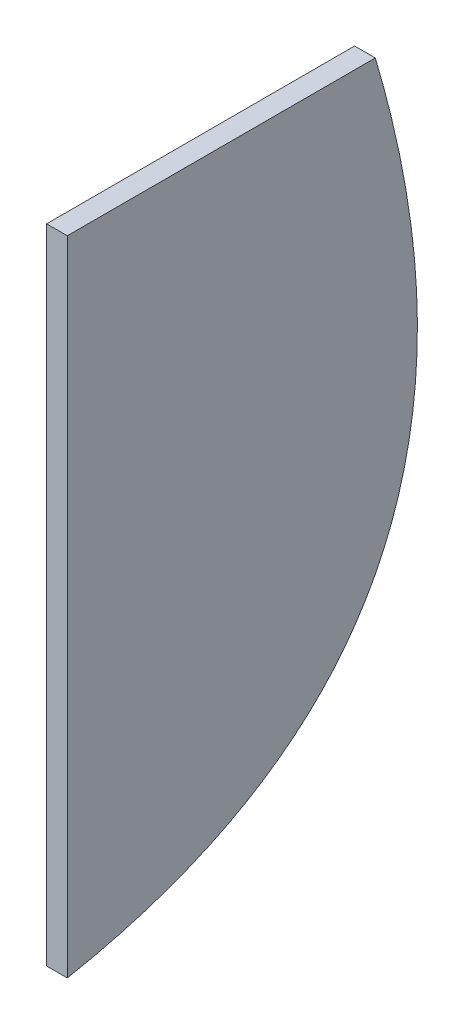
ISO-10303-21;
HEADER;
FILE_DESCRIPTION(('STEP AP214'),'2;1');
FILE_NAME('part.step','',(''),(''),'','','');
FILE_SCHEMA(('AUTOMOTIVE_DESIGN { 1 0 10303 214 1 1 1 1 }'));
ENDSEC;
DATA;
#1=APPLICATION_CONTEXT('core data for automotive mechanical design processes');
#2=APPLICATION_PROTOCOL_DEFINITION('international standard','automotive_design',2000,#1);
#3=PRODUCT_CONTEXT('',#1,'mechanical');
#4=PRODUCT('Part','Part','',(#3));
#5=PRODUCT_RELATED_PRODUCT_CATEGORY('part','',(#4));
#6=PRODUCT_DEFINITION_FORMATION('','',#4);
#7=PRODUCT_DEFINITION_CONTEXT('part definition',#1,'design');
#8=PRODUCT_DEFINITION('design','',#6,#7);
#9=PRODUCT_DEFINITION_SHAPE('','',#8);
#10=(LENGTH_UNIT() NAMED_UNIT(*) SI_UNIT(.MILLI.,.METRE.));
#11=(NAMED_UNIT(*) PLANE_ANGLE_UNIT() SI_UNIT($,.RADIAN.));
#12=(NAMED_UNIT(*) SI_UNIT($,.STERADIAN.) SOLID_ANGLE_UNIT());
#13=UNCERTAINTY_MEASURE_WITH_UNIT(LENGTH_MEASURE(1.E-05),#10,'distance_accuracy_value','');
#14=(GEOMETRIC_REPRESENTATION_CONTEXT(3) GLOBAL_UNCERTAINTY_ASSIGNED_CONTEXT((#13)) GLOBAL_UNIT_ASSIGNED_CONTEXT((#10,
#11,#12)) REPRESENTATION_CONTEXT('',''));
#15=CARTESIAN_POINT('',(0.,0.,0.));
#16=DIRECTION('',(0.,0.,1.));
#17=DIRECTION('',(1.,0.,0.));
#18=AXIS2_PLACEMENT_3D('',#15,#16,#17);
#19=CARTESIAN_POINT('',(40.,-621.12652434776,376.591845045944));
#20=CARTESIAN_POINT('',(40.,-449.321139122768,-534.618522950127));
#21=CARTESIAN_POINT('',(40.,621.12652434776,-218.56516714176));
#22=B_SPLINE_CURVE_WITH_KNOTS('',2,(#19,#20,#21),.UNSPECIFIED.,.F.,.F.,(3,3),(0.,1.),.UNSPECIFIED.);
#23=DIRECTION('',(-1.,0.,0.));
#24=VECTOR('',#23,1.);
#25=SURFACE_OF_LINEAR_EXTRUSION('',#22,#24);
#26=CARTESIAN_POINT('',(0.,-621.12652434776,376.591845045944));
#27=CARTESIAN_POINT('',(0.,-449.321139122768,-534.618522950127));
#28=CARTESIAN_POINT('',(0.,621.12652434776,-218.56516714176));
#29=B_SPLINE_CURVE_WITH_KNOTS('',2,(#26,#27,#28),.UNSPECIFIED.,.F.,.F.,(3,3),(0.,1.),.UNSPECIFIED.);
#30=CARTESIAN_POINT('',(0.,-621.12652434776,376.591845045944));
#31=VERTEX_POINT('',#30);
#32=CARTESIAN_POINT('',(0.,621.12652434776,-218.56516714176));
#33=VERTEX_POINT('',#32);
#34=EDGE_CURVE('E89',#31,#33,#29,.T.);
#35=ORIENTED_EDGE('',*,*,#34,.T.);
#36=DIRECTION('',(-1.,0.,0.));
#37=VECTOR('',#36,1.);
#38=CARTESIAN_POINT('',(40.,621.12652434776,-218.56516714176));
#39=LINE('',#38,#37);
#40=CARTESIAN_POINT('',(40.,621.12652434776,-218.56516714176));
#41=VERTEX_POINT('',#40);
#42=EDGE_CURVE('E11',#41,#33,#39,.T.);
#43=ORIENTED_EDGE('',*,*,#42,.F.);
#44=CARTESIAN_POINT('',(40.,-621.12652434776,376.591845045944));
#45=VERTEX_POINT('',#44);
#46=EDGE_CURVE('E83',#45,#41,#22,.T.);
#47=ORIENTED_EDGE('',*,*,#46,.F.);
#48=DIRECTION('',(-1.,0.,0.));
#49=VECTOR('',#48,1.);
#50=CARTESIAN_POINT('',(40.,-621.12652434776,376.591845045944));
#51=LINE('',#50,#49);
#52=EDGE_CURVE('E90',#45,#31,#51,.T.);
#53=ORIENTED_EDGE('',*,*,#52,.T.);
#54=EDGE_LOOP('',(#35,#43,#47,#53));
#55=FACE_BOUND('',#54,.T.);
#56=ADVANCED_FACE('F39',(#55),#25,.F.);
#57=CARTESIAN_POINT('',(40.,621.12652434776,-218.56516714176));
#58=DIRECTION('',(0.,-1.,0.));
#59=DIRECTION('',(0.,0.,-1.));
#60=AXIS2_PLACEMENT_3D('',#57,#58,#59);
#61=PLANE('',#60);
#62=DIRECTION('',(0.,0.,1.));
#63=VECTOR('',#62,1.);
#64=CARTESIAN_POINT('',(0.,621.12652434776,-218.56516714176));
#65=LINE('',#64,#63);
#66=CARTESIAN_POINT('',(0.,621.12652434776,376.591845045944));
#67=VERTEX_POINT('',#66);
#68=EDGE_CURVE('E92',#33,#67,#65,.T.);
#69=ORIENTED_EDGE('',*,*,#68,.T.);
#70=DIRECTION('',(-1.,0.,0.));
#71=VECTOR('',#70,1.);
#72=CARTESIAN_POINT('',(40.,621.12652434776,376.591845045944));
#73=LINE('',#72,#71);
#74=CARTESIAN_POINT('',(40.,621.12652434776,376.591845045944));
#75=VERTEX_POINT('',#74);
#76=EDGE_CURVE('E49',#75,#67,#73,.T.);
#77=ORIENTED_EDGE('',*,*,#76,.F.);
#78=DIRECTION('',(0.,0.,1.));
#79=VECTOR('',#78,1.);
#80=CARTESIAN_POINT('',(40.,621.12652434776,-218.56516714176));
#81=LINE('',#80,#79);
#82=EDGE_CURVE('E78',#41,#75,#81,.T.);
#83=ORIENTED_EDGE('',*,*,#82,.F.);
#84=ORIENTED_EDGE('',*,*,#42,.T.);
#85=EDGE_LOOP('',(#69,#77,#83,#84));
#86=FACE_BOUND('',#85,.T.);
#87=ADVANCED_FACE('F79',(#86),#61,.F.);
#88=CARTESIAN_POINT('',(40.,-103.87347565224,376.591845045944));
#89=DIRECTION('',(0.,0.,-1.));
#90=DIRECTION('',(-1.,0.,0.));
#91=AXIS2_PLACEMENT_3D('',#88,#89,#90);
#92=PLANE('',#91);
#93=DIRECTION('',(0.,-1.,0.));
#94=VECTOR('',#93,1.);
#95=CARTESIAN_POINT('',(0.,-103.87347565224,376.591845045944));
#96=LINE('',#95,#94);
#97=EDGE_CURVE('E70',#67,#31,#96,.T.);
#98=ORIENTED_EDGE('',*,*,#97,.T.);
#99=ORIENTED_EDGE('',*,*,#52,.F.);
#100=DIRECTION('',(0.,-1.,0.));
#101=VECTOR('',#100,1.);
#102=CARTESIAN_POINT('',(40.,621.12652434776,376.591845045944));
#103=LINE('',#102,#101);
#104=EDGE_CURVE('E57',#75,#45,#103,.T.);
#105=ORIENTED_EDGE('',*,*,#104,.F.);
#106=ORIENTED_EDGE('',*,*,#76,.T.);
#107=EDGE_LOOP('',(#98,#99,#105,#106));
#108=FACE_BOUND('',#107,.T.);
#109=ADVANCED_FACE('F107',(#108),#92,.F.);
#110=CARTESIAN_POINT('',(40.,-224.660569561384,-227.802591999018));
#111=DIRECTION('',(1.,0.,0.));
#112=DIRECTION('',(0.,0.,-1.));
#113=AXIS2_PLACEMENT_3D('',#110,#111,#112);
#114=PLANE('',#113);
#115=ORIENTED_EDGE('',*,*,#46,.T.);
#116=ORIENTED_EDGE('',*,*,#82,.T.);
#117=ORIENTED_EDGE('',*,*,#104,.T.);
#118=EDGE_LOOP('',(#115,#116,#117));
#119=FACE_BOUND('',#118,.T.);
#120=ADVANCED_FACE('F86',(#119),#114,.T.);
#121=CARTESIAN_POINT('',(0.,-224.660569561384,-227.802591999018));
#122=DIRECTION('',(1.,0.,0.));
#123=DIRECTION('',(0.,0.,-1.));
#124=AXIS2_PLACEMENT_3D('',#121,#122,#123);
#125=PLANE('',#124);
#126=ORIENTED_EDGE('',*,*,#34,.F.);
#127=ORIENTED_EDGE('',*,*,#97,.F.);
#128=ORIENTED_EDGE('',*,*,#68,.F.);
#129=EDGE_LOOP('',(#126,#127,#128));
#130=FACE_BOUND('',#129,.T.);
#131=ADVANCED_FACE('F115',(#130),#125,.F.);
#132=CLOSED_SHELL('',(#56,#87,#109,#120,#131));
#133=MANIFOLD_SOLID_BREP('B2',#132);
#134=ADVANCED_BREP_SHAPE_REPRESENTATION('',(#18,#133),#14);
#135=SHAPE_DEFINITION_REPRESENTATION(#9,#134);
ENDSEC;
END-ISO-10303-21;
